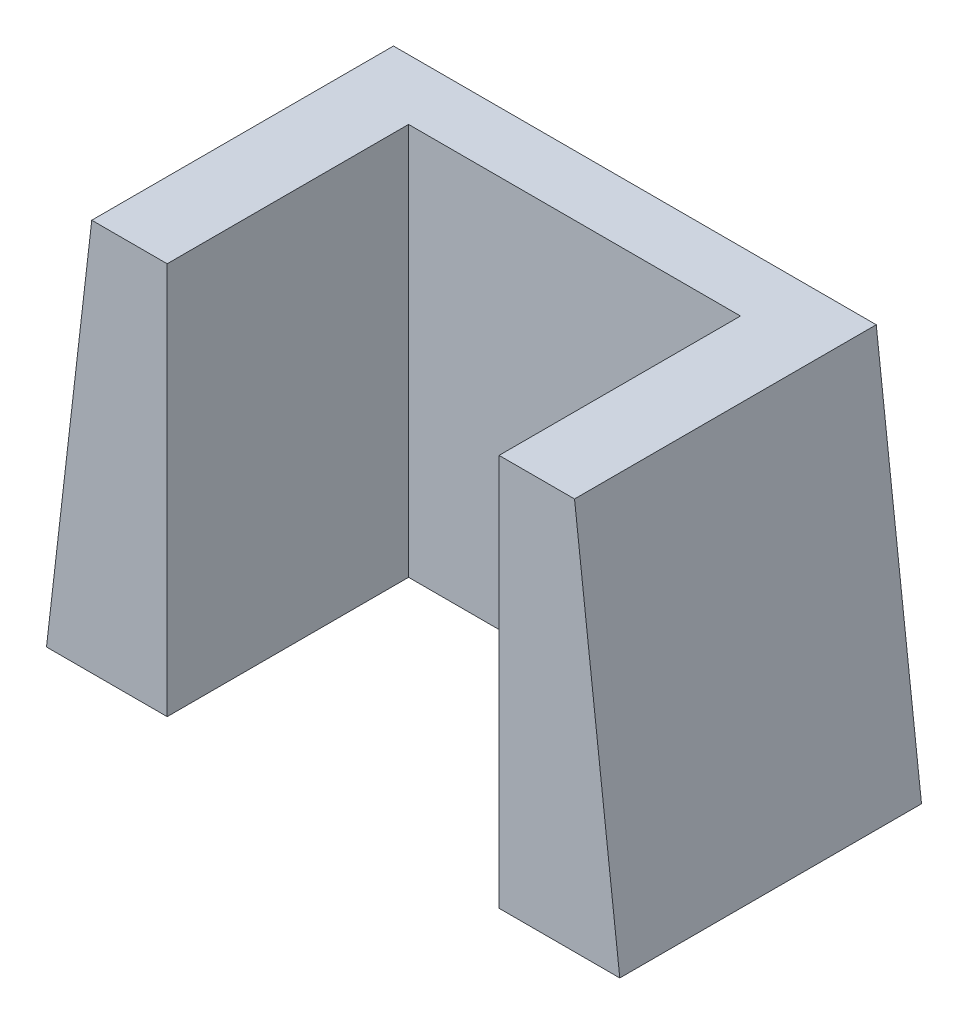
ISO-10303-21;
HEADER;
FILE_DESCRIPTION(('STEP AP214'),'2;1');
FILE_NAME('part.step','',(''),(''),'','','');
FILE_SCHEMA(('AUTOMOTIVE_DESIGN { 1 0 10303 214 1 1 1 1 }'));
ENDSEC;
DATA;
#1=APPLICATION_CONTEXT('core data for automotive mechanical design processes');
#2=APPLICATION_PROTOCOL_DEFINITION('international standard','automotive_design',2000,#1);
#3=PRODUCT_CONTEXT('',#1,'mechanical');
#4=PRODUCT('Part','Part','',(#3));
#5=PRODUCT_RELATED_PRODUCT_CATEGORY('part','',(#4));
#6=PRODUCT_DEFINITION_FORMATION('','',#4);
#7=PRODUCT_DEFINITION_CONTEXT('part definition',#1,'design');
#8=PRODUCT_DEFINITION('design','',#6,#7);
#9=PRODUCT_DEFINITION_SHAPE('','',#8);
#10=(LENGTH_UNIT() NAMED_UNIT(*) SI_UNIT(.MILLI.,.METRE.));
#11=(NAMED_UNIT(*) PLANE_ANGLE_UNIT() SI_UNIT($,.RADIAN.));
#12=(NAMED_UNIT(*) SI_UNIT($,.STERADIAN.) SOLID_ANGLE_UNIT());
#13=UNCERTAINTY_MEASURE_WITH_UNIT(LENGTH_MEASURE(1.E-05),#10,'distance_accuracy_value','');
#14=(GEOMETRIC_REPRESENTATION_CONTEXT(3) GLOBAL_UNCERTAINTY_ASSIGNED_CONTEXT((#13)) GLOBAL_UNIT_ASSIGNED_CONTEXT((#10,
#11,#12)) REPRESENTATION_CONTEXT('',''));
#15=CARTESIAN_POINT('',(0.,0.,0.));
#16=DIRECTION('',(0.,0.,1.));
#17=DIRECTION('',(1.,0.,0.));
#18=AXIS2_PLACEMENT_3D('',#15,#16,#17);
#19=CARTESIAN_POINT('',(0.,0.,10.));
#20=DIRECTION('',(0.,0.,1.));
#21=DIRECTION('',(1.,0.,0.));
#22=AXIS2_PLACEMENT_3D('',#19,#20,#21);
#23=PLANE('',#22);
#24=DIRECTION('',(0.,1.,0.));
#25=VECTOR('',#24,1.);
#26=CARTESIAN_POINT('',(-5.5,0.,10.));
#27=LINE('',#26,#25);
#28=CARTESIAN_POINT('',(-5.5,0.,10.));
#29=VERTEX_POINT('',#28);
#30=CARTESIAN_POINT('',(-5.5,13.,10.));
#31=VERTEX_POINT('',#30);
#32=EDGE_CURVE('E110',#29,#31,#27,.T.);
#33=ORIENTED_EDGE('',*,*,#32,.T.);
#34=DIRECTION('',(-1.,0.,0.));
#35=VECTOR('',#34,1.);
#36=CARTESIAN_POINT('',(8.,13.,10.));
#37=LINE('',#36,#35);
#38=CARTESIAN_POINT('',(-8.,13.,10.));
#39=VERTEX_POINT('',#38);
#40=EDGE_CURVE('E59',#31,#39,#37,.T.);
#41=ORIENTED_EDGE('',*,*,#40,.T.);
#42=DIRECTION('',(-0.11462410798513,-0.993408935871131,0.));
#43=VECTOR('',#42,1.);
#44=CARTESIAN_POINT('',(-8.,13.,10.));
#45=LINE('',#44,#43);
#46=CARTESIAN_POINT('',(-9.5,0.,10.));
#47=VERTEX_POINT('',#46);
#48=EDGE_CURVE('E124',#39,#47,#45,.T.);
#49=ORIENTED_EDGE('',*,*,#48,.T.);
#50=DIRECTION('',(1.,0.,0.));
#51=VECTOR('',#50,1.);
#52=CARTESIAN_POINT('',(-9.5,0.,10.));
#53=LINE('',#52,#51);
#54=EDGE_CURVE('E88',#47,#29,#53,.T.);
#55=ORIENTED_EDGE('',*,*,#54,.T.);
#56=EDGE_LOOP('',(#33,#41,#49,#55));
#57=FACE_BOUND('',#56,.T.);
#58=ADVANCED_FACE('F35',(#57),#23,.T.);
#59=CARTESIAN_POINT('',(-8.,13.,10.));
#60=DIRECTION('',(0.993408935871131,-0.11462410798513,0.));
#61=DIRECTION('',(0.11462410798513,0.993408935871131,0.));
#62=AXIS2_PLACEMENT_3D('',#59,#60,#61);
#63=PLANE('',#62);
#64=DIRECTION('',(-0.11462410798513,-0.993408935871131,0.));
#65=VECTOR('',#64,1.);
#66=CARTESIAN_POINT('',(-8.,13.,0.));
#67=LINE('',#66,#65);
#68=CARTESIAN_POINT('',(-8.,13.,0.));
#69=VERTEX_POINT('',#68);
#70=CARTESIAN_POINT('',(-9.5,0.,0.));
#71=VERTEX_POINT('',#70);
#72=EDGE_CURVE('E136',#69,#71,#67,.T.);
#73=ORIENTED_EDGE('',*,*,#72,.T.);
#74=DIRECTION('',(0.,0.,-1.));
#75=VECTOR('',#74,1.);
#76=CARTESIAN_POINT('',(-9.5,0.,10.));
#77=LINE('',#76,#75);
#78=EDGE_CURVE('E11',#47,#71,#77,.T.);
#79=ORIENTED_EDGE('',*,*,#78,.F.);
#80=ORIENTED_EDGE('',*,*,#48,.F.);
#81=DIRECTION('',(0.,0.,-1.));
#82=VECTOR('',#81,1.);
#83=CARTESIAN_POINT('',(-8.,13.,10.));
#84=LINE('',#83,#82);
#85=EDGE_CURVE('E135',#39,#69,#84,.T.);
#86=ORIENTED_EDGE('',*,*,#85,.T.);
#87=EDGE_LOOP('',(#73,#79,#80,#86));
#88=FACE_BOUND('',#87,.T.);
#89=ADVANCED_FACE('F37',(#88),#63,.F.);
#90=CARTESIAN_POINT('',(-9.5,0.,10.));
#91=DIRECTION('',(0.,1.,0.));
#92=DIRECTION('',(-1.,0.,0.));
#93=AXIS2_PLACEMENT_3D('',#90,#91,#92);
#94=PLANE('',#93);
#95=DIRECTION('',(-1.,0.,0.));
#96=VECTOR('',#95,1.);
#97=CARTESIAN_POINT('',(-5.5,0.,2.));
#98=LINE('',#97,#96);
#99=CARTESIAN_POINT('',(5.5,0.,1.99999999999999));
#100=VERTEX_POINT('',#99);
#101=CARTESIAN_POINT('',(-5.5,0.,2.));
#102=VERTEX_POINT('',#101);
#103=EDGE_CURVE('E117',#100,#102,#98,.T.);
#104=ORIENTED_EDGE('',*,*,#103,.T.);
#105=DIRECTION('',(0.,0.,1.));
#106=VECTOR('',#105,1.);
#107=CARTESIAN_POINT('',(-5.5,0.,10.));
#108=LINE('',#107,#106);
#109=EDGE_CURVE('E112',#102,#29,#108,.T.);
#110=ORIENTED_EDGE('',*,*,#109,.T.);
#111=ORIENTED_EDGE('',*,*,#54,.F.);
#112=ORIENTED_EDGE('',*,*,#78,.T.);
#113=DIRECTION('',(1.,0.,0.));
#114=VECTOR('',#113,1.);
#115=CARTESIAN_POINT('',(-9.5,0.,0.));
#116=LINE('',#115,#114);
#117=CARTESIAN_POINT('',(9.5,0.,0.));
#118=VERTEX_POINT('',#117);
#119=EDGE_CURVE('E139',#71,#118,#116,.T.);
#120=ORIENTED_EDGE('',*,*,#119,.T.);
#121=DIRECTION('',(0.,0.,-1.));
#122=VECTOR('',#121,1.);
#123=CARTESIAN_POINT('',(9.5,0.,10.));
#124=LINE('',#123,#122);
#125=CARTESIAN_POINT('',(9.5,0.,10.));
#126=VERTEX_POINT('',#125);
#127=EDGE_CURVE('E43',#126,#118,#124,.T.);
#128=ORIENTED_EDGE('',*,*,#127,.F.);
#129=CARTESIAN_POINT('',(5.5,0.,10.));
#130=VERTEX_POINT('',#129);
#131=EDGE_CURVE('E127',#130,#126,#53,.T.);
#132=ORIENTED_EDGE('',*,*,#131,.F.);
#133=DIRECTION('',(0.,0.,-1.));
#134=VECTOR('',#133,1.);
#135=CARTESIAN_POINT('',(5.5,0.,9.99999999999999));
#136=LINE('',#135,#134);
#137=EDGE_CURVE('E50',#130,#100,#136,.T.);
#138=ORIENTED_EDGE('',*,*,#137,.T.);
#139=EDGE_LOOP('',(#104,#110,#111,#112,#120,#128,#132,#138));
#140=FACE_BOUND('',#139,.T.);
#141=ADVANCED_FACE('F119',(#140),#94,.F.);
#142=CARTESIAN_POINT('',(9.5,0.,10.));
#143=DIRECTION('',(-0.993408935871131,-0.114624107985131,0.));
#144=DIRECTION('',(0.114624107985131,-0.993408935871131,0.));
#145=AXIS2_PLACEMENT_3D('',#142,#143,#144);
#146=PLANE('',#145);
#147=DIRECTION('',(-0.114624107985131,0.993408935871131,0.));
#148=VECTOR('',#147,1.);
#149=CARTESIAN_POINT('',(9.5,0.,0.));
#150=LINE('',#149,#148);
#151=CARTESIAN_POINT('',(8.,13.,0.));
#152=VERTEX_POINT('',#151);
#153=EDGE_CURVE('E142',#118,#152,#150,.T.);
#154=ORIENTED_EDGE('',*,*,#153,.T.);
#155=DIRECTION('',(0.,0.,-1.));
#156=VECTOR('',#155,1.);
#157=CARTESIAN_POINT('',(8.,13.,10.));
#158=LINE('',#157,#156);
#159=CARTESIAN_POINT('',(8.,13.,10.));
#160=VERTEX_POINT('',#159);
#161=EDGE_CURVE('E146',#160,#152,#158,.T.);
#162=ORIENTED_EDGE('',*,*,#161,.F.);
#163=DIRECTION('',(-0.114624107985131,0.993408935871131,0.));
#164=VECTOR('',#163,1.);
#165=CARTESIAN_POINT('',(9.5,0.,10.));
#166=LINE('',#165,#164);
#167=EDGE_CURVE('E126',#126,#160,#166,.T.);
#168=ORIENTED_EDGE('',*,*,#167,.F.);
#169=ORIENTED_EDGE('',*,*,#127,.T.);
#170=EDGE_LOOP('',(#154,#162,#168,#169));
#171=FACE_BOUND('',#170,.T.);
#172=ADVANCED_FACE('F152',(#171),#146,.F.);
#173=CARTESIAN_POINT('',(8.,13.,10.));
#174=DIRECTION('',(0.,-1.,0.));
#175=DIRECTION('',(1.,0.,0.));
#176=AXIS2_PLACEMENT_3D('',#173,#174,#175);
#177=PLANE('',#176);
#178=ORIENTED_EDGE('',*,*,#40,.F.);
#179=DIRECTION('',(0.,0.,1.));
#180=VECTOR('',#179,1.);
#181=CARTESIAN_POINT('',(-5.5,13.,10.));
#182=LINE('',#181,#180);
#183=CARTESIAN_POINT('',(-5.5,13.,2.));
#184=VERTEX_POINT('',#183);
#185=EDGE_CURVE('E115',#184,#31,#182,.T.);
#186=ORIENTED_EDGE('',*,*,#185,.F.);
#187=DIRECTION('',(-1.,0.,0.));
#188=VECTOR('',#187,1.);
#189=CARTESIAN_POINT('',(-5.5,13.,2.));
#190=LINE('',#189,#188);
#191=CARTESIAN_POINT('',(5.5,13.,1.99999999999999));
#192=VERTEX_POINT('',#191);
#193=EDGE_CURVE('E121',#192,#184,#190,.T.);
#194=ORIENTED_EDGE('',*,*,#193,.F.);
#195=DIRECTION('',(0.,0.,-1.));
#196=VECTOR('',#195,1.);
#197=CARTESIAN_POINT('',(5.5,13.,9.99999999999999));
#198=LINE('',#197,#196);
#199=CARTESIAN_POINT('',(5.5,13.,9.99999999999999));
#200=VERTEX_POINT('',#199);
#201=EDGE_CURVE('E163',#200,#192,#198,.T.);
#202=ORIENTED_EDGE('',*,*,#201,.F.);
#203=EDGE_CURVE('E132',#160,#200,#37,.T.);
#204=ORIENTED_EDGE('',*,*,#203,.F.);
#205=ORIENTED_EDGE('',*,*,#161,.T.);
#206=DIRECTION('',(-1.,0.,0.));
#207=VECTOR('',#206,1.);
#208=CARTESIAN_POINT('',(8.,13.,0.));
#209=LINE('',#208,#207);
#210=EDGE_CURVE('E81',#152,#69,#209,.T.);
#211=ORIENTED_EDGE('',*,*,#210,.T.);
#212=ORIENTED_EDGE('',*,*,#85,.F.);
#213=EDGE_LOOP('',(#178,#186,#194,#202,#204,#205,#211,#212));
#214=FACE_BOUND('',#213,.T.);
#215=ADVANCED_FACE('F159',(#214),#177,.F.);
#216=DIRECTION('',(0.,1.,0.));
#217=VECTOR('',#216,1.);
#218=CARTESIAN_POINT('',(5.5,0.,9.99999999999999));
#219=LINE('',#218,#217);
#220=EDGE_CURVE('E116',#130,#200,#219,.T.);
#221=ORIENTED_EDGE('',*,*,#220,.F.);
#222=ORIENTED_EDGE('',*,*,#131,.T.);
#223=ORIENTED_EDGE('',*,*,#167,.T.);
#224=ORIENTED_EDGE('',*,*,#203,.T.);
#225=EDGE_LOOP('',(#221,#222,#223,#224));
#226=FACE_BOUND('',#225,.T.);
#227=ADVANCED_FACE('F177',(#226),#23,.T.);
#228=CARTESIAN_POINT('',(0.,0.,0.));
#229=DIRECTION('',(0.,0.,1.));
#230=DIRECTION('',(1.,0.,0.));
#231=AXIS2_PLACEMENT_3D('',#228,#229,#230);
#232=PLANE('',#231);
#233=ORIENTED_EDGE('',*,*,#72,.F.);
#234=ORIENTED_EDGE('',*,*,#210,.F.);
#235=ORIENTED_EDGE('',*,*,#153,.F.);
#236=ORIENTED_EDGE('',*,*,#119,.F.);
#237=EDGE_LOOP('',(#233,#234,#235,#236));
#238=FACE_BOUND('',#237,.T.);
#239=ADVANCED_FACE('F157',(#238),#232,.F.);
#240=CARTESIAN_POINT('',(-5.5,0.,10.));
#241=DIRECTION('',(-1.,0.,0.));
#242=DIRECTION('',(0.,0.,1.));
#243=AXIS2_PLACEMENT_3D('',#240,#241,#242);
#244=PLANE('',#243);
#245=ORIENTED_EDGE('',*,*,#185,.T.);
#246=ORIENTED_EDGE('',*,*,#32,.F.);
#247=ORIENTED_EDGE('',*,*,#109,.F.);
#248=DIRECTION('',(0.,1.,0.));
#249=VECTOR('',#248,1.);
#250=CARTESIAN_POINT('',(-5.5,0.,2.));
#251=LINE('',#250,#249);
#252=EDGE_CURVE('E140',#102,#184,#251,.T.);
#253=ORIENTED_EDGE('',*,*,#252,.T.);
#254=EDGE_LOOP('',(#245,#246,#247,#253));
#255=FACE_BOUND('',#254,.T.);
#256=ADVANCED_FACE('F111',(#255),#244,.F.);
#257=CARTESIAN_POINT('',(-5.5,0.,2.));
#258=DIRECTION('',(0.,0.,-1.));
#259=DIRECTION('',(-1.,0.,0.));
#260=AXIS2_PLACEMENT_3D('',#257,#258,#259);
#261=PLANE('',#260);
#262=ORIENTED_EDGE('',*,*,#193,.T.);
#263=ORIENTED_EDGE('',*,*,#252,.F.);
#264=ORIENTED_EDGE('',*,*,#103,.F.);
#265=DIRECTION('',(0.,1.,0.));
#266=VECTOR('',#265,1.);
#267=CARTESIAN_POINT('',(5.5,0.,1.99999999999999));
#268=LINE('',#267,#266);
#269=EDGE_CURVE('E172',#100,#192,#268,.T.);
#270=ORIENTED_EDGE('',*,*,#269,.T.);
#271=EDGE_LOOP('',(#262,#263,#264,#270));
#272=FACE_BOUND('',#271,.T.);
#273=ADVANCED_FACE('F221',(#272),#261,.F.);
#274=CARTESIAN_POINT('',(5.5,0.,9.99999999999999));
#275=DIRECTION('',(1.,0.,0.));
#276=DIRECTION('',(0.,0.,-1.));
#277=AXIS2_PLACEMENT_3D('',#274,#275,#276);
#278=PLANE('',#277);
#279=ORIENTED_EDGE('',*,*,#201,.T.);
#280=ORIENTED_EDGE('',*,*,#269,.F.);
#281=ORIENTED_EDGE('',*,*,#137,.F.);
#282=ORIENTED_EDGE('',*,*,#220,.T.);
#283=EDGE_LOOP('',(#279,#280,#281,#282));
#284=FACE_BOUND('',#283,.T.);
#285=ADVANCED_FACE('F174',(#284),#278,.F.);
#286=CLOSED_SHELL('',(#58,#89,#141,#172,#215,#227,#239,#256,#273,#285));
#287=MANIFOLD_SOLID_BREP('B2',#286);
#288=ADVANCED_BREP_SHAPE_REPRESENTATION('',(#18,#287),#14);
#289=SHAPE_DEFINITION_REPRESENTATION(#9,#288);
ENDSEC;
END-ISO-10303-21;
